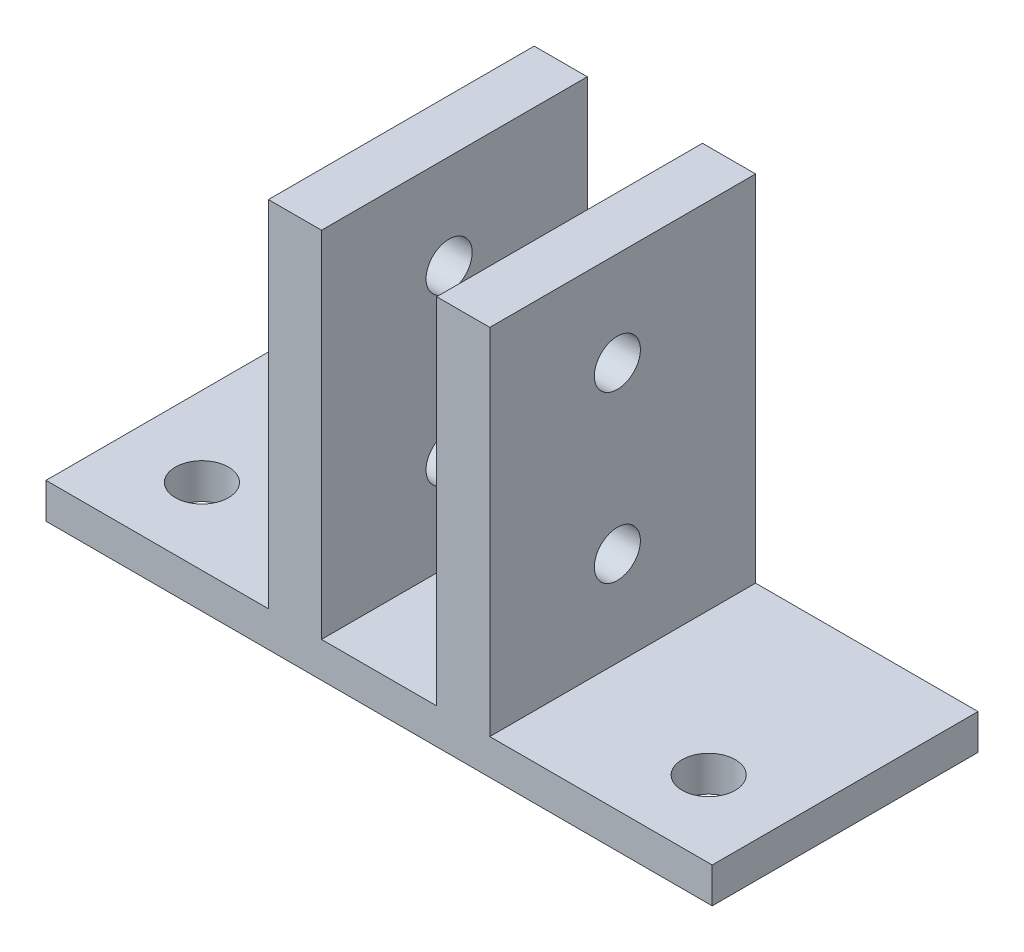
ISO-10303-21;
HEADER;
FILE_DESCRIPTION(('STEP AP214'),'2;1');
FILE_NAME('part.step','',(''),(''),'','','');
FILE_SCHEMA(('AUTOMOTIVE_DESIGN { 1 0 10303 214 1 1 1 1 }'));
ENDSEC;
DATA;
#1=APPLICATION_CONTEXT('core data for automotive mechanical design processes');
#2=APPLICATION_PROTOCOL_DEFINITION('international standard','automotive_design',2000,#1);
#3=PRODUCT_CONTEXT('',#1,'mechanical');
#4=PRODUCT('Part','Part','',(#3));
#5=PRODUCT_RELATED_PRODUCT_CATEGORY('part','',(#4));
#6=PRODUCT_DEFINITION_FORMATION('','',#4);
#7=PRODUCT_DEFINITION_CONTEXT('part definition',#1,'design');
#8=PRODUCT_DEFINITION('design','',#6,#7);
#9=PRODUCT_DEFINITION_SHAPE('','',#8);
#10=(LENGTH_UNIT() NAMED_UNIT(*) SI_UNIT(.MILLI.,.METRE.));
#11=(NAMED_UNIT(*) PLANE_ANGLE_UNIT() SI_UNIT($,.RADIAN.));
#12=(NAMED_UNIT(*) SI_UNIT($,.STERADIAN.) SOLID_ANGLE_UNIT());
#13=UNCERTAINTY_MEASURE_WITH_UNIT(LENGTH_MEASURE(1.E-05),#10,'distance_accuracy_value','');
#14=(GEOMETRIC_REPRESENTATION_CONTEXT(3) GLOBAL_UNCERTAINTY_ASSIGNED_CONTEXT((#13)) GLOBAL_UNIT_ASSIGNED_CONTEXT((#10,
#11,#12)) REPRESENTATION_CONTEXT('',''));
#15=CARTESIAN_POINT('',(0.,0.,0.));
#16=DIRECTION('',(0.,0.,1.));
#17=DIRECTION('',(1.,0.,0.));
#18=AXIS2_PLACEMENT_3D('',#15,#16,#17);
#19=CARTESIAN_POINT('',(0.,2.,0.));
#20=DIRECTION('',(0.,1.,0.));
#21=DIRECTION('',(0.,0.,1.));
#22=AXIS2_PLACEMENT_3D('',#19,#20,#21);
#23=PLANE('',#22);
#24=CARTESIAN_POINT('',(14.3,2.,3.2));
#25=DIRECTION('',(0.,1.,0.));
#26=DIRECTION('',(0.,0.,1.));
#27=AXIS2_PLACEMENT_3D('',#24,#25,#26);
#28=CIRCLE('',#27,1.5);
#29=CARTESIAN_POINT('',(14.3,2.,4.7));
#30=VERTEX_POINT('',#29);
#31=EDGE_CURVE('E201',#30,#30,#28,.T.);
#32=ORIENTED_EDGE('',*,*,#31,.F.);
#33=EDGE_LOOP('',(#32));
#34=FACE_BOUND('',#33,.T.);
#35=DIRECTION('',(-1.,0.,0.));
#36=VECTOR('',#35,1.);
#37=CARTESIAN_POINT('',(18.8,2.,-7.5));
#38=LINE('',#37,#36);
#39=CARTESIAN_POINT('',(18.8,2.,-7.5));
#40=VERTEX_POINT('',#39);
#41=CARTESIAN_POINT('',(6.24739312319026,2.,-7.5));
#42=VERTEX_POINT('',#41);
#43=EDGE_CURVE('E141',#40,#42,#38,.T.);
#44=ORIENTED_EDGE('',*,*,#43,.T.);
#45=DIRECTION('',(0.,0.,-1.));
#46=VECTOR('',#45,1.);
#47=CARTESIAN_POINT('',(6.24739312319024,2.,7.50000000000002));
#48=LINE('',#47,#46);
#49=CARTESIAN_POINT('',(6.24739312319025,2.,7.50000000000001));
#50=VERTEX_POINT('',#49);
#51=EDGE_CURVE('E56',#50,#42,#48,.T.);
#52=ORIENTED_EDGE('',*,*,#51,.F.);
#53=DIRECTION('',(1.,0.,0.));
#54=VECTOR('',#53,1.);
#55=CARTESIAN_POINT('',(-18.8,2.,7.50000000000002));
#56=LINE('',#55,#54);
#57=CARTESIAN_POINT('',(18.8,2.,7.5));
#58=VERTEX_POINT('',#57);
#59=EDGE_CURVE('E210',#50,#58,#56,.T.);
#60=ORIENTED_EDGE('',*,*,#59,.T.);
#61=DIRECTION('',(0.,0.,-1.));
#62=VECTOR('',#61,1.);
#63=CARTESIAN_POINT('',(18.8,2.,7.5));
#64=LINE('',#63,#62);
#65=EDGE_CURVE('E214',#58,#40,#64,.T.);
#66=ORIENTED_EDGE('',*,*,#65,.T.);
#67=EDGE_LOOP('',(#44,#52,#60,#66));
#68=FACE_BOUND('',#67,.T.);
#69=ADVANCED_FACE('F39',(#34,#68),#23,.T.);
#70=CARTESIAN_POINT('',(-3.25,2.,7.50000000000001));
#71=VERTEX_POINT('',#70);
#72=CARTESIAN_POINT('',(3.24999999999996,2.,7.50000000000001));
#73=VERTEX_POINT('',#72);
#74=EDGE_CURVE('E64',#71,#73,#56,.T.);
#75=ORIENTED_EDGE('',*,*,#74,.T.);
#76=DIRECTION('',(0.,0.,1.));
#77=VECTOR('',#76,1.);
#78=CARTESIAN_POINT('',(3.24999999999999,2.,-7.50000000000003));
#79=LINE('',#78,#77);
#80=CARTESIAN_POINT('',(3.24999999999999,2.,-7.50000000000003));
#81=VERTEX_POINT('',#80);
#82=EDGE_CURVE('E144',#81,#73,#79,.T.);
#83=ORIENTED_EDGE('',*,*,#82,.F.);
#84=CARTESIAN_POINT('',(-3.24999999999999,2.,-7.5));
#85=VERTEX_POINT('',#84);
#86=EDGE_CURVE('E131',#81,#85,#38,.T.);
#87=ORIENTED_EDGE('',*,*,#86,.T.);
#88=DIRECTION('',(0.,0.,-1.));
#89=VECTOR('',#88,1.);
#90=CARTESIAN_POINT('',(-3.25,2.,-7.50000000000003));
#91=LINE('',#90,#89);
#92=EDGE_CURVE('E175',#71,#85,#91,.T.);
#93=ORIENTED_EDGE('',*,*,#92,.F.);
#94=EDGE_LOOP('',(#75,#83,#87,#93));
#95=FACE_BOUND('',#94,.T.);
#96=ADVANCED_FACE('F145',(#95),#23,.T.);
#97=DIRECTION('',(0.,0.,1.));
#98=VECTOR('',#97,1.);
#99=CARTESIAN_POINT('',(-6.24739312319028,2.,7.50000000000001));
#100=LINE('',#99,#98);
#101=CARTESIAN_POINT('',(-6.24739312319027,2.,-7.50000000000001));
#102=VERTEX_POINT('',#101);
#103=CARTESIAN_POINT('',(-6.24739312319028,2.,7.50000000000001));
#104=VERTEX_POINT('',#103);
#105=EDGE_CURVE('E163',#102,#104,#100,.T.);
#106=ORIENTED_EDGE('',*,*,#105,.F.);
#107=CARTESIAN_POINT('',(-18.8,2.,-7.50000000000001));
#108=VERTEX_POINT('',#107);
#109=EDGE_CURVE('E142',#102,#108,#38,.T.);
#110=ORIENTED_EDGE('',*,*,#109,.T.);
#111=DIRECTION('',(0.,0.,1.));
#112=VECTOR('',#111,1.);
#113=CARTESIAN_POINT('',(-18.8,2.,7.50000000000002));
#114=LINE('',#113,#112);
#115=CARTESIAN_POINT('',(-18.8,2.,7.50000000000002));
#116=VERTEX_POINT('',#115);
#117=EDGE_CURVE('E207',#108,#116,#114,.T.);
#118=ORIENTED_EDGE('',*,*,#117,.T.);
#119=EDGE_CURVE('E212',#116,#104,#56,.T.);
#120=ORIENTED_EDGE('',*,*,#119,.T.);
#121=EDGE_LOOP('',(#106,#110,#118,#120));
#122=FACE_BOUND('',#121,.T.);
#123=CARTESIAN_POINT('',(-14.3,2.,3.19999999999998));
#124=DIRECTION('',(0.,1.,0.));
#125=DIRECTION('',(0.,0.,-1.));
#126=AXIS2_PLACEMENT_3D('',#123,#124,#125);
#127=CIRCLE('',#126,1.5);
#128=CARTESIAN_POINT('',(-14.3,2.,1.69999999999998));
#129=VERTEX_POINT('',#128);
#130=EDGE_CURVE('E195',#129,#129,#127,.T.);
#131=ORIENTED_EDGE('',*,*,#130,.F.);
#132=EDGE_LOOP('',(#131));
#133=FACE_BOUND('',#132,.T.);
#134=ADVANCED_FACE('F285',(#122,#133),#23,.T.);
#135=CARTESIAN_POINT('',(0.,0.,0.));
#136=DIRECTION('',(0.,1.,0.));
#137=DIRECTION('',(0.,0.,1.));
#138=AXIS2_PLACEMENT_3D('',#135,#136,#137);
#139=PLANE('',#138);
#140=DIRECTION('',(0.,0.,1.));
#141=VECTOR('',#140,1.);
#142=CARTESIAN_POINT('',(-18.8,0.,7.50000000000002));
#143=LINE('',#142,#141);
#144=CARTESIAN_POINT('',(-18.8,0.,-7.50000000000001));
#145=VERTEX_POINT('',#144);
#146=CARTESIAN_POINT('',(-18.8,0.,7.50000000000002));
#147=VERTEX_POINT('',#146);
#148=EDGE_CURVE('E204',#145,#147,#143,.T.);
#149=ORIENTED_EDGE('',*,*,#148,.F.);
#150=DIRECTION('',(-1.,0.,0.));
#151=VECTOR('',#150,1.);
#152=CARTESIAN_POINT('',(18.8,0.,-7.5));
#153=LINE('',#152,#151);
#154=CARTESIAN_POINT('',(18.8,0.,-7.5));
#155=VERTEX_POINT('',#154);
#156=EDGE_CURVE('E211',#155,#145,#153,.T.);
#157=ORIENTED_EDGE('',*,*,#156,.F.);
#158=DIRECTION('',(0.,0.,-1.));
#159=VECTOR('',#158,1.);
#160=CARTESIAN_POINT('',(18.8,0.,7.5));
#161=LINE('',#160,#159);
#162=CARTESIAN_POINT('',(18.8,0.,7.5));
#163=VERTEX_POINT('',#162);
#164=EDGE_CURVE('E221',#163,#155,#161,.T.);
#165=ORIENTED_EDGE('',*,*,#164,.F.);
#166=DIRECTION('',(1.,0.,0.));
#167=VECTOR('',#166,1.);
#168=CARTESIAN_POINT('',(-18.8,0.,7.50000000000002));
#169=LINE('',#168,#167);
#170=EDGE_CURVE('E219',#147,#163,#169,.T.);
#171=ORIENTED_EDGE('',*,*,#170,.F.);
#172=EDGE_LOOP('',(#149,#157,#165,#171));
#173=FACE_BOUND('',#172,.T.);
#174=CARTESIAN_POINT('',(14.3,0.,3.2));
#175=DIRECTION('',(0.,1.,0.));
#176=DIRECTION('',(0.,0.,1.));
#177=AXIS2_PLACEMENT_3D('',#174,#175,#176);
#178=CIRCLE('',#177,1.5);
#179=CARTESIAN_POINT('',(14.3,0.,4.7));
#180=VERTEX_POINT('',#179);
#181=EDGE_CURVE('E198',#180,#180,#178,.T.);
#182=ORIENTED_EDGE('',*,*,#181,.T.);
#183=EDGE_LOOP('',(#182));
#184=FACE_BOUND('',#183,.T.);
#185=CARTESIAN_POINT('',(-14.3,0.,3.19999999999998));
#186=DIRECTION('',(0.,1.,0.));
#187=DIRECTION('',(0.,0.,-1.));
#188=AXIS2_PLACEMENT_3D('',#185,#186,#187);
#189=CIRCLE('',#188,1.5);
#190=CARTESIAN_POINT('',(-14.3,0.,1.69999999999998));
#191=VERTEX_POINT('',#190);
#192=EDGE_CURVE('E194',#191,#191,#189,.T.);
#193=ORIENTED_EDGE('',*,*,#192,.T.);
#194=EDGE_LOOP('',(#193));
#195=FACE_BOUND('',#194,.T.);
#196=ADVANCED_FACE('F293',(#173,#184,#195),#139,.F.);
#197=CARTESIAN_POINT('',(-18.8,2.,7.50000000000002));
#198=DIRECTION('',(1.,0.,0.));
#199=DIRECTION('',(0.,0.,-1.));
#200=AXIS2_PLACEMENT_3D('',#197,#198,#199);
#201=PLANE('',#200);
#202=ORIENTED_EDGE('',*,*,#148,.T.);
#203=DIRECTION('',(0.,-1.,0.));
#204=VECTOR('',#203,1.);
#205=CARTESIAN_POINT('',(-18.8,2.,7.50000000000002));
#206=LINE('',#205,#204);
#207=EDGE_CURVE('E11',#116,#147,#206,.T.);
#208=ORIENTED_EDGE('',*,*,#207,.F.);
#209=ORIENTED_EDGE('',*,*,#117,.F.);
#210=DIRECTION('',(0.,-1.,0.));
#211=VECTOR('',#210,1.);
#212=CARTESIAN_POINT('',(-18.8,2.,-7.50000000000001));
#213=LINE('',#212,#211);
#214=EDGE_CURVE('E216',#108,#145,#213,.T.);
#215=ORIENTED_EDGE('',*,*,#214,.T.);
#216=EDGE_LOOP('',(#202,#208,#209,#215));
#217=FACE_BOUND('',#216,.T.);
#218=ADVANCED_FACE('F41',(#217),#201,.F.);
#219=CARTESIAN_POINT('',(-18.8,2.,7.50000000000002));
#220=DIRECTION('',(0.,0.,-1.));
#221=DIRECTION('',(-1.,0.,0.));
#222=AXIS2_PLACEMENT_3D('',#219,#220,#221);
#223=PLANE('',#222);
#224=ORIENTED_EDGE('',*,*,#170,.T.);
#225=DIRECTION('',(0.,-1.,0.));
#226=VECTOR('',#225,1.);
#227=CARTESIAN_POINT('',(18.8,2.,7.5));
#228=LINE('',#227,#226);
#229=EDGE_CURVE('E48',#58,#163,#228,.T.);
#230=ORIENTED_EDGE('',*,*,#229,.F.);
#231=ORIENTED_EDGE('',*,*,#59,.F.);
#232=DIRECTION('',(0.,-1.,0.));
#233=VECTOR('',#232,1.);
#234=CARTESIAN_POINT('',(6.24739312319024,22.,7.50000000000002));
#235=LINE('',#234,#233);
#236=CARTESIAN_POINT('',(6.24739312319024,22.,7.50000000000002));
#237=VERTEX_POINT('',#236);
#238=EDGE_CURVE('E158',#237,#50,#235,.T.);
#239=ORIENTED_EDGE('',*,*,#238,.F.);
#240=DIRECTION('',(1.,0.,0.));
#241=VECTOR('',#240,1.);
#242=CARTESIAN_POINT('',(3.24999999999997,22.,7.50000000000002));
#243=LINE('',#242,#241);
#244=CARTESIAN_POINT('',(3.24999999999997,22.,7.50000000000002));
#245=VERTEX_POINT('',#244);
#246=EDGE_CURVE('E149',#245,#237,#243,.T.);
#247=ORIENTED_EDGE('',*,*,#246,.F.);
#248=DIRECTION('',(0.,-1.,0.));
#249=VECTOR('',#248,1.);
#250=CARTESIAN_POINT('',(3.24999999999997,22.,7.50000000000002));
#251=LINE('',#250,#249);
#252=EDGE_CURVE('E153',#245,#73,#251,.T.);
#253=ORIENTED_EDGE('',*,*,#252,.T.);
#254=ORIENTED_EDGE('',*,*,#74,.F.);
#255=DIRECTION('',(0.,-1.,0.));
#256=VECTOR('',#255,1.);
#257=CARTESIAN_POINT('',(-3.25,22.,7.50000000000001));
#258=LINE('',#257,#256);
#259=CARTESIAN_POINT('',(-3.25,22.,7.50000000000001));
#260=VERTEX_POINT('',#259);
#261=EDGE_CURVE('E185',#260,#71,#258,.T.);
#262=ORIENTED_EDGE('',*,*,#261,.F.);
#263=DIRECTION('',(1.,0.,0.));
#264=VECTOR('',#263,1.);
#265=CARTESIAN_POINT('',(-3.25,22.,7.50000000000001));
#266=LINE('',#265,#264);
#267=CARTESIAN_POINT('',(-6.24739312319028,22.,7.50000000000001));
#268=VERTEX_POINT('',#267);
#269=EDGE_CURVE('E177',#268,#260,#266,.T.);
#270=ORIENTED_EDGE('',*,*,#269,.F.);
#271=DIRECTION('',(0.,-1.,0.));
#272=VECTOR('',#271,1.);
#273=CARTESIAN_POINT('',(-6.24739312319028,22.,7.50000000000001));
#274=LINE('',#273,#272);
#275=EDGE_CURVE('E188',#268,#104,#274,.T.);
#276=ORIENTED_EDGE('',*,*,#275,.T.);
#277=ORIENTED_EDGE('',*,*,#119,.F.);
#278=ORIENTED_EDGE('',*,*,#207,.T.);
#279=EDGE_LOOP('',(#224,#230,#231,#239,#247,#253,#254,#262,#270,#276,#277,#278));
#280=FACE_BOUND('',#279,.T.);
#281=ADVANCED_FACE('F261',(#280),#223,.F.);
#282=CARTESIAN_POINT('',(18.8,2.,7.5));
#283=DIRECTION('',(-1.,0.,0.));
#284=DIRECTION('',(0.,0.,1.));
#285=AXIS2_PLACEMENT_3D('',#282,#283,#284);
#286=PLANE('',#285);
#287=ORIENTED_EDGE('',*,*,#164,.T.);
#288=DIRECTION('',(0.,-1.,0.));
#289=VECTOR('',#288,1.);
#290=CARTESIAN_POINT('',(18.8,2.,-7.5));
#291=LINE('',#290,#289);
#292=EDGE_CURVE('E226',#40,#155,#291,.T.);
#293=ORIENTED_EDGE('',*,*,#292,.F.);
#294=ORIENTED_EDGE('',*,*,#65,.F.);
#295=ORIENTED_EDGE('',*,*,#229,.T.);
#296=EDGE_LOOP('',(#287,#293,#294,#295));
#297=FACE_BOUND('',#296,.T.);
#298=ADVANCED_FACE('F267',(#297),#286,.F.);
#299=CARTESIAN_POINT('',(18.8,2.,-7.5));
#300=DIRECTION('',(0.,0.,1.));
#301=DIRECTION('',(1.,0.,0.));
#302=AXIS2_PLACEMENT_3D('',#299,#300,#301);
#303=PLANE('',#302);
#304=ORIENTED_EDGE('',*,*,#156,.T.);
#305=ORIENTED_EDGE('',*,*,#214,.F.);
#306=ORIENTED_EDGE('',*,*,#109,.F.);
#307=DIRECTION('',(0.,-1.,0.));
#308=VECTOR('',#307,1.);
#309=CARTESIAN_POINT('',(-6.24739312319027,22.,-7.50000000000001));
#310=LINE('',#309,#308);
#311=CARTESIAN_POINT('',(-6.24739312319027,22.,-7.50000000000001));
#312=VERTEX_POINT('',#311);
#313=EDGE_CURVE('E191',#312,#102,#310,.T.);
#314=ORIENTED_EDGE('',*,*,#313,.F.);
#315=DIRECTION('',(-1.,0.,0.));
#316=VECTOR('',#315,1.);
#317=CARTESIAN_POINT('',(-6.24739312319027,22.,-7.50000000000001));
#318=LINE('',#317,#316);
#319=CARTESIAN_POINT('',(-3.25,22.,-7.50000000000003));
#320=VERTEX_POINT('',#319);
#321=EDGE_CURVE('E171',#320,#312,#318,.T.);
#322=ORIENTED_EDGE('',*,*,#321,.F.);
#323=DIRECTION('',(0.,-1.,0.));
#324=VECTOR('',#323,1.);
#325=CARTESIAN_POINT('',(-3.25,22.,-7.50000000000003));
#326=LINE('',#325,#324);
#327=EDGE_CURVE('E139',#320,#85,#326,.T.);
#328=ORIENTED_EDGE('',*,*,#327,.T.);
#329=ORIENTED_EDGE('',*,*,#86,.F.);
#330=DIRECTION('',(0.,-1.,0.));
#331=VECTOR('',#330,1.);
#332=CARTESIAN_POINT('',(3.24999999999999,22.,-7.50000000000003));
#333=LINE('',#332,#331);
#334=CARTESIAN_POINT('',(3.24999999999999,22.,-7.50000000000003));
#335=VERTEX_POINT('',#334);
#336=EDGE_CURVE('E135',#335,#81,#333,.T.);
#337=ORIENTED_EDGE('',*,*,#336,.F.);
#338=DIRECTION('',(-1.,0.,0.));
#339=VECTOR('',#338,1.);
#340=CARTESIAN_POINT('',(6.24739312319026,22.,-7.5));
#341=LINE('',#340,#339);
#342=CARTESIAN_POINT('',(6.24739312319026,22.,-7.5));
#343=VERTEX_POINT('',#342);
#344=EDGE_CURVE('E165',#343,#335,#341,.T.);
#345=ORIENTED_EDGE('',*,*,#344,.F.);
#346=DIRECTION('',(0.,-1.,0.));
#347=VECTOR('',#346,1.);
#348=CARTESIAN_POINT('',(6.24739312319026,22.,-7.5));
#349=LINE('',#348,#347);
#350=EDGE_CURVE('E154',#343,#42,#349,.T.);
#351=ORIENTED_EDGE('',*,*,#350,.T.);
#352=ORIENTED_EDGE('',*,*,#43,.F.);
#353=ORIENTED_EDGE('',*,*,#292,.T.);
#354=EDGE_LOOP('',(#304,#305,#306,#314,#322,#328,#329,#337,#345,#351,#352,#353));
#355=FACE_BOUND('',#354,.T.);
#356=ADVANCED_FACE('F132',(#355),#303,.F.);
#357=CARTESIAN_POINT('',(14.3,2.,3.2));
#358=DIRECTION('',(0.,-1.,0.));
#359=DIRECTION('',(0.,0.,-1.));
#360=AXIS2_PLACEMENT_3D('',#357,#358,#359);
#361=CYLINDRICAL_SURFACE('',#360,1.5);
#362=ORIENTED_EDGE('',*,*,#31,.T.);
#363=EDGE_LOOP('',(#362));
#364=FACE_BOUND('',#363,.T.);
#365=ORIENTED_EDGE('',*,*,#181,.F.);
#366=EDGE_LOOP('',(#365));
#367=FACE_BOUND('',#366,.T.);
#368=ADVANCED_FACE('F303',(#364,#367),#361,.F.);
#369=CARTESIAN_POINT('',(-14.3,2.,3.19999999999998));
#370=DIRECTION('',(0.,-1.,0.));
#371=DIRECTION('',(0.,0.,-1.));
#372=AXIS2_PLACEMENT_3D('',#369,#370,#371);
#373=CYLINDRICAL_SURFACE('',#372,1.5);
#374=ORIENTED_EDGE('',*,*,#130,.T.);
#375=EDGE_LOOP('',(#374));
#376=FACE_BOUND('',#375,.T.);
#377=ORIENTED_EDGE('',*,*,#192,.F.);
#378=EDGE_LOOP('',(#377));
#379=FACE_BOUND('',#378,.T.);
#380=ADVANCED_FACE('F301',(#376,#379),#373,.F.);
#381=CARTESIAN_POINT('',(-6.24739312319028,22.,7.50000000000001));
#382=DIRECTION('',(1.,0.,0.));
#383=DIRECTION('',(0.,0.,-1.));
#384=AXIS2_PLACEMENT_3D('',#381,#382,#383);
#385=PLANE('',#384);
#386=CARTESIAN_POINT('',(-6.24739312319028,16.6696762552587,0.30000000000001));
#387=DIRECTION('',(-1.,0.,0.));
#388=DIRECTION('',(0.,0.,1.));
#389=AXIS2_PLACEMENT_3D('',#386,#387,#388);
#390=CIRCLE('',#389,1.3);
#391=CARTESIAN_POINT('',(-6.24739312319028,16.6696762552587,1.60000000000001));
#392=VERTEX_POINT('',#391);
#393=EDGE_CURVE('E233',#392,#392,#390,.T.);
#394=ORIENTED_EDGE('',*,*,#393,.F.);
#395=EDGE_LOOP('',(#394));
#396=FACE_BOUND('',#395,.T.);
#397=CARTESIAN_POINT('',(-6.24739312319028,7.33032374474126,0.30000000000001));
#398=DIRECTION('',(-1.,0.,0.));
#399=DIRECTION('',(0.,0.,-1.));
#400=AXIS2_PLACEMENT_3D('',#397,#398,#399);
#401=CIRCLE('',#400,1.3);
#402=CARTESIAN_POINT('',(-6.24739312319028,7.33032374474126,-0.99999999999999));
#403=VERTEX_POINT('',#402);
#404=EDGE_CURVE('E240',#403,#403,#401,.T.);
#405=ORIENTED_EDGE('',*,*,#404,.F.);
#406=EDGE_LOOP('',(#405));
#407=FACE_BOUND('',#406,.T.);
#408=ORIENTED_EDGE('',*,*,#105,.T.);
#409=ORIENTED_EDGE('',*,*,#275,.F.);
#410=DIRECTION('',(0.,0.,1.));
#411=VECTOR('',#410,1.);
#412=CARTESIAN_POINT('',(-6.24739312319028,22.,7.50000000000001));
#413=LINE('',#412,#411);
#414=EDGE_CURVE('E174',#312,#268,#413,.T.);
#415=ORIENTED_EDGE('',*,*,#414,.F.);
#416=ORIENTED_EDGE('',*,*,#313,.T.);
#417=EDGE_LOOP('',(#408,#409,#415,#416));
#418=FACE_BOUND('',#417,.T.);
#419=ADVANCED_FACE('F282',(#396,#407,#418),#385,.F.);
#420=CARTESIAN_POINT('',(-3.25,22.,-7.50000000000003));
#421=DIRECTION('',(-1.,0.,0.));
#422=DIRECTION('',(0.,0.,1.));
#423=AXIS2_PLACEMENT_3D('',#420,#421,#422);
#424=PLANE('',#423);
#425=CARTESIAN_POINT('',(-3.25,16.6696762552587,0.300000000000011));
#426=DIRECTION('',(-1.,0.,0.));
#427=DIRECTION('',(0.,0.,1.));
#428=AXIS2_PLACEMENT_3D('',#425,#426,#427);
#429=CIRCLE('',#428,1.3);
#430=CARTESIAN_POINT('',(-3.25,16.6696762552587,1.60000000000001));
#431=VERTEX_POINT('',#430);
#432=EDGE_CURVE('E252',#431,#431,#429,.T.);
#433=ORIENTED_EDGE('',*,*,#432,.T.);
#434=EDGE_LOOP('',(#433));
#435=FACE_BOUND('',#434,.T.);
#436=CARTESIAN_POINT('',(-3.25,7.33032374474126,0.300000000000011));
#437=DIRECTION('',(-1.,0.,0.));
#438=DIRECTION('',(0.,0.,1.));
#439=AXIS2_PLACEMENT_3D('',#436,#437,#438);
#440=CIRCLE('',#439,1.3);
#441=CARTESIAN_POINT('',(-3.25,7.33032374474126,1.60000000000001));
#442=VERTEX_POINT('',#441);
#443=EDGE_CURVE('E237',#442,#442,#440,.T.);
#444=ORIENTED_EDGE('',*,*,#443,.T.);
#445=EDGE_LOOP('',(#444));
#446=FACE_BOUND('',#445,.T.);
#447=ORIENTED_EDGE('',*,*,#92,.T.);
#448=ORIENTED_EDGE('',*,*,#327,.F.);
#449=DIRECTION('',(0.,0.,-1.));
#450=VECTOR('',#449,1.);
#451=CARTESIAN_POINT('',(-3.25,22.,-7.50000000000003));
#452=LINE('',#451,#450);
#453=EDGE_CURVE('E179',#260,#320,#452,.T.);
#454=ORIENTED_EDGE('',*,*,#453,.F.);
#455=ORIENTED_EDGE('',*,*,#261,.T.);
#456=EDGE_LOOP('',(#447,#448,#454,#455));
#457=FACE_BOUND('',#456,.T.);
#458=ADVANCED_FACE('F276',(#435,#446,#457),#424,.F.);
#459=CARTESIAN_POINT('',(0.,22.,0.));
#460=DIRECTION('',(0.,-1.,0.));
#461=DIRECTION('',(0.,0.,-1.));
#462=AXIS2_PLACEMENT_3D('',#459,#460,#461);
#463=PLANE('',#462);
#464=ORIENTED_EDGE('',*,*,#321,.T.);
#465=ORIENTED_EDGE('',*,*,#414,.T.);
#466=ORIENTED_EDGE('',*,*,#269,.T.);
#467=ORIENTED_EDGE('',*,*,#453,.T.);
#468=EDGE_LOOP('',(#464,#465,#466,#467));
#469=FACE_BOUND('',#468,.T.);
#470=ADVANCED_FACE('F278',(#469),#463,.F.);
#471=CARTESIAN_POINT('',(6.24739312319024,22.,7.50000000000002));
#472=DIRECTION('',(-1.,0.,0.));
#473=DIRECTION('',(0.,0.,1.));
#474=AXIS2_PLACEMENT_3D('',#471,#472,#473);
#475=PLANE('',#474);
#476=CARTESIAN_POINT('',(6.24739312319025,16.6696762552587,0.300000000000013));
#477=DIRECTION('',(-1.,0.,0.));
#478=DIRECTION('',(0.,0.,1.));
#479=AXIS2_PLACEMENT_3D('',#476,#477,#478);
#480=CIRCLE('',#479,1.3);
#481=CARTESIAN_POINT('',(6.24739312319025,16.6696762552587,1.60000000000001));
#482=VERTEX_POINT('',#481);
#483=EDGE_CURVE('E249',#482,#482,#480,.T.);
#484=ORIENTED_EDGE('',*,*,#483,.T.);
#485=EDGE_LOOP('',(#484));
#486=FACE_BOUND('',#485,.T.);
#487=CARTESIAN_POINT('',(6.24739312319025,7.33032374474126,0.300000000000013));
#488=DIRECTION('',(-1.,0.,0.));
#489=DIRECTION('',(0.,0.,1.));
#490=AXIS2_PLACEMENT_3D('',#487,#488,#489);
#491=CIRCLE('',#490,1.3);
#492=CARTESIAN_POINT('',(6.24739312319025,7.33032374474126,1.60000000000001));
#493=VERTEX_POINT('',#492);
#494=EDGE_CURVE('E232',#493,#493,#491,.T.);
#495=ORIENTED_EDGE('',*,*,#494,.T.);
#496=EDGE_LOOP('',(#495));
#497=FACE_BOUND('',#496,.T.);
#498=ORIENTED_EDGE('',*,*,#51,.T.);
#499=ORIENTED_EDGE('',*,*,#350,.F.);
#500=DIRECTION('',(0.,0.,-1.));
#501=VECTOR('',#500,1.);
#502=CARTESIAN_POINT('',(6.24739312319024,22.,7.50000000000002));
#503=LINE('',#502,#501);
#504=EDGE_CURVE('E167',#237,#343,#503,.T.);
#505=ORIENTED_EDGE('',*,*,#504,.F.);
#506=ORIENTED_EDGE('',*,*,#238,.T.);
#507=EDGE_LOOP('',(#498,#499,#505,#506));
#508=FACE_BOUND('',#507,.T.);
#509=ADVANCED_FACE('F257',(#486,#497,#508),#475,.F.);
#510=CARTESIAN_POINT('',(3.24999999999999,22.,-7.50000000000003));
#511=DIRECTION('',(1.,0.,0.));
#512=DIRECTION('',(0.,0.,-1.));
#513=AXIS2_PLACEMENT_3D('',#510,#511,#512);
#514=PLANE('',#513);
#515=CARTESIAN_POINT('',(3.24999999999998,16.6696762552587,0.300000000000012));
#516=DIRECTION('',(1.,0.,0.));
#517=DIRECTION('',(0.,0.,-1.));
#518=AXIS2_PLACEMENT_3D('',#515,#516,#517);
#519=CIRCLE('',#518,1.3);
#520=CARTESIAN_POINT('',(3.24999999999998,16.6696762552587,-0.999999999999987));
#521=VERTEX_POINT('',#520);
#522=EDGE_CURVE('E43',#521,#521,#519,.T.);
#523=ORIENTED_EDGE('',*,*,#522,.T.);
#524=EDGE_LOOP('',(#523));
#525=FACE_BOUND('',#524,.T.);
#526=CARTESIAN_POINT('',(3.24999999999998,7.33032374474126,0.300000000000012));
#527=DIRECTION('',(1.,0.,0.));
#528=DIRECTION('',(0.,0.,-1.));
#529=AXIS2_PLACEMENT_3D('',#526,#527,#528);
#530=CIRCLE('',#529,1.3);
#531=CARTESIAN_POINT('',(3.24999999999998,7.33032374474126,-0.999999999999987));
#532=VERTEX_POINT('',#531);
#533=EDGE_CURVE('E230',#532,#532,#530,.T.);
#534=ORIENTED_EDGE('',*,*,#533,.T.);
#535=EDGE_LOOP('',(#534));
#536=FACE_BOUND('',#535,.T.);
#537=ORIENTED_EDGE('',*,*,#82,.T.);
#538=ORIENTED_EDGE('',*,*,#252,.F.);
#539=DIRECTION('',(0.,0.,1.));
#540=VECTOR('',#539,1.);
#541=CARTESIAN_POINT('',(3.24999999999999,22.,-7.50000000000003));
#542=LINE('',#541,#540);
#543=EDGE_CURVE('E152',#335,#245,#542,.T.);
#544=ORIENTED_EDGE('',*,*,#543,.F.);
#545=ORIENTED_EDGE('',*,*,#336,.T.);
#546=EDGE_LOOP('',(#537,#538,#544,#545));
#547=FACE_BOUND('',#546,.T.);
#548=ADVANCED_FACE('F151',(#525,#536,#547),#514,.F.);
#549=CARTESIAN_POINT('',(0.,22.,0.));
#550=DIRECTION('',(0.,1.,0.));
#551=DIRECTION('',(0.,0.,1.));
#552=AXIS2_PLACEMENT_3D('',#549,#550,#551);
#553=PLANE('',#552);
#554=ORIENTED_EDGE('',*,*,#246,.T.);
#555=ORIENTED_EDGE('',*,*,#504,.T.);
#556=ORIENTED_EDGE('',*,*,#344,.T.);
#557=ORIENTED_EDGE('',*,*,#543,.T.);
#558=EDGE_LOOP('',(#554,#555,#556,#557));
#559=FACE_BOUND('',#558,.T.);
#560=ADVANCED_FACE('F271',(#559),#553,.T.);
#561=CARTESIAN_POINT('',(13.7526068768097,7.33032374474126,0.300000000000015));
#562=DIRECTION('',(-1.,0.,0.));
#563=DIRECTION('',(0.,0.,1.));
#564=AXIS2_PLACEMENT_3D('',#561,#562,#563);
#565=CYLINDRICAL_SURFACE('',#564,1.3);
#566=ORIENTED_EDGE('',*,*,#533,.F.);
#567=EDGE_LOOP('',(#566));
#568=FACE_BOUND('',#567,.T.);
#569=ORIENTED_EDGE('',*,*,#494,.F.);
#570=EDGE_LOOP('',(#569));
#571=FACE_BOUND('',#570,.T.);
#572=ADVANCED_FACE('F356',(#568,#571),#565,.F.);
#573=CARTESIAN_POINT('',(13.7526068768097,16.6696762552587,0.300000000000015));
#574=DIRECTION('',(-1.,0.,0.));
#575=DIRECTION('',(0.,0.,1.));
#576=AXIS2_PLACEMENT_3D('',#573,#574,#575);
#577=CYLINDRICAL_SURFACE('',#576,1.3);
#578=ORIENTED_EDGE('',*,*,#522,.F.);
#579=EDGE_LOOP('',(#578));
#580=FACE_BOUND('',#579,.T.);
#581=ORIENTED_EDGE('',*,*,#483,.F.);
#582=EDGE_LOOP('',(#581));
#583=FACE_BOUND('',#582,.T.);
#584=ADVANCED_FACE('F391',(#580,#583),#577,.F.);
#585=ORIENTED_EDGE('',*,*,#404,.T.);
#586=EDGE_LOOP('',(#585));
#587=FACE_BOUND('',#586,.T.);
#588=ORIENTED_EDGE('',*,*,#443,.F.);
#589=EDGE_LOOP('',(#588));
#590=FACE_BOUND('',#589,.T.);
#591=ADVANCED_FACE('F394',(#587,#590),#565,.F.);
#592=ORIENTED_EDGE('',*,*,#393,.T.);
#593=EDGE_LOOP('',(#592));
#594=FACE_BOUND('',#593,.T.);
#595=ORIENTED_EDGE('',*,*,#432,.F.);
#596=EDGE_LOOP('',(#595));
#597=FACE_BOUND('',#596,.T.);
#598=ADVANCED_FACE('F403',(#594,#597),#577,.F.);
#599=CLOSED_SHELL('',(#69,#96,#134,#196,#218,#281,#298,#356,#368,#380,#419,#458,#470,#509,#548,
#560,#572,#584,#591,#598));
#600=MANIFOLD_SOLID_BREP('B2',#599);
#601=ADVANCED_BREP_SHAPE_REPRESENTATION('',(#18,#600),#14);
#602=SHAPE_DEFINITION_REPRESENTATION(#9,#601);
ENDSEC;
END-ISO-10303-21;
